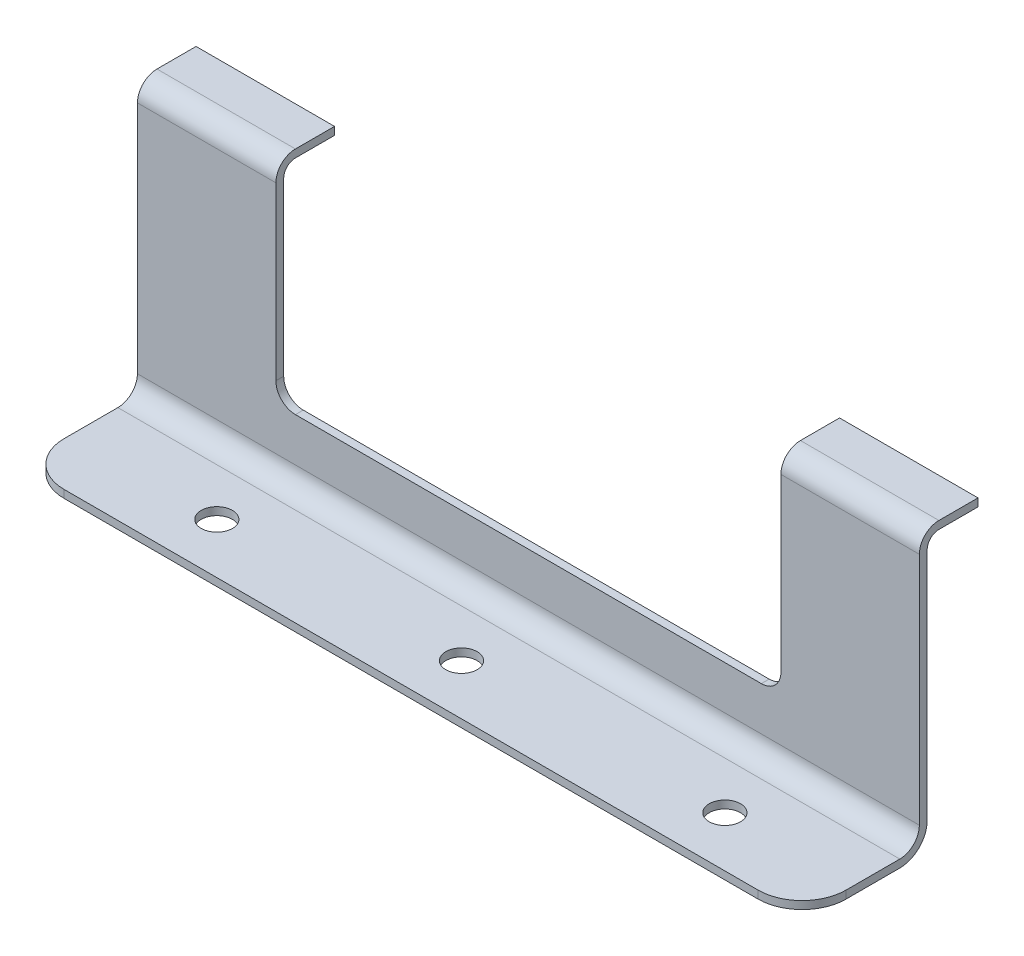
ISO-10303-21;
HEADER;
FILE_DESCRIPTION(('STEP AP214'),'2;1');
FILE_NAME('part.step','',(''),(''),'','','');
FILE_SCHEMA(('AUTOMOTIVE_DESIGN { 1 0 10303 214 1 1 1 1 }'));
ENDSEC;
DATA;
#1=APPLICATION_CONTEXT('core data for automotive mechanical design processes');
#2=APPLICATION_PROTOCOL_DEFINITION('international standard','automotive_design',2000,#1);
#3=PRODUCT_CONTEXT('',#1,'mechanical');
#4=PRODUCT('Part','Part','',(#3));
#5=PRODUCT_RELATED_PRODUCT_CATEGORY('part','',(#4));
#6=PRODUCT_DEFINITION_FORMATION('','',#4);
#7=PRODUCT_DEFINITION_CONTEXT('part definition',#1,'design');
#8=PRODUCT_DEFINITION('design','',#6,#7);
#9=PRODUCT_DEFINITION_SHAPE('','',#8);
#10=(LENGTH_UNIT() NAMED_UNIT(*) SI_UNIT(.MILLI.,.METRE.));
#11=(NAMED_UNIT(*) PLANE_ANGLE_UNIT() SI_UNIT($,.RADIAN.));
#12=(NAMED_UNIT(*) SI_UNIT($,.STERADIAN.) SOLID_ANGLE_UNIT());
#13=UNCERTAINTY_MEASURE_WITH_UNIT(LENGTH_MEASURE(1.E-05),#10,'distance_accuracy_value','');
#14=(GEOMETRIC_REPRESENTATION_CONTEXT(3) GLOBAL_UNCERTAINTY_ASSIGNED_CONTEXT((#13)) GLOBAL_UNIT_ASSIGNED_CONTEXT((#10,
#11,#12)) REPRESENTATION_CONTEXT('',''));
#15=CARTESIAN_POINT('',(0.,0.,0.));
#16=DIRECTION('',(0.,0.,1.));
#17=DIRECTION('',(1.,0.,0.));
#18=AXIS2_PLACEMENT_3D('',#15,#16,#17);
#19=CARTESIAN_POINT('',(200.,60.5454545454545,-8.80675383506639));
#20=DIRECTION('',(0.,0.,1.));
#21=DIRECTION('',(1.,0.,0.));
#22=AXIS2_PLACEMENT_3D('',#19,#20,#21);
#23=PLANE('',#22);
#24=DIRECTION('',(-1.,0.,0.));
#25=VECTOR('',#24,1.);
#26=CARTESIAN_POINT('',(200.,64.5454545454545,-8.80675383506639));
#27=LINE('',#26,#25);
#28=CARTESIAN_POINT('',(-129.169068804265,64.5454545454545,-8.80675383506639));
#29=VERTEX_POINT('',#28);
#30=CARTESIAN_POINT('',(-200.,64.5454545454545,-8.80675383506639));
#31=VERTEX_POINT('',#30);
#32=EDGE_CURVE('E447',#29,#31,#27,.T.);
#33=ORIENTED_EDGE('',*,*,#32,.F.);
#34=DIRECTION('',(0.,-1.,0.));
#35=VECTOR('',#34,1.);
#36=CARTESIAN_POINT('',(-129.169068804265,60.5454545454545,-8.80675383506639));
#37=LINE('',#36,#35);
#38=CARTESIAN_POINT('',(-129.169068804265,60.5454545454545,-8.80675383506639));
#39=VERTEX_POINT('',#38);
#40=EDGE_CURVE('E277',#29,#39,#37,.T.);
#41=ORIENTED_EDGE('',*,*,#40,.T.);
#42=DIRECTION('',(-1.,0.,0.));
#43=VECTOR('',#42,1.);
#44=CARTESIAN_POINT('',(200.,60.5454545454545,-8.80675383506639));
#45=LINE('',#44,#43);
#46=CARTESIAN_POINT('',(-200.,60.5454545454545,-8.80675383506639));
#47=VERTEX_POINT('',#46);
#48=EDGE_CURVE('E360',#39,#47,#45,.T.);
#49=ORIENTED_EDGE('',*,*,#48,.T.);
#50=DIRECTION('',(0.,1.,0.));
#51=VECTOR('',#50,1.);
#52=CARTESIAN_POINT('',(-200.,60.5454545454545,-8.80675383506639));
#53=LINE('',#52,#51);
#54=EDGE_CURVE('E323',#47,#31,#53,.T.);
#55=ORIENTED_EDGE('',*,*,#54,.T.);
#56=EDGE_LOOP('',(#33,#41,#49,#55));
#57=FACE_BOUND('',#56,.T.);
#58=ADVANCED_FACE('F43',(#57),#23,.F.);
#59=CARTESIAN_POINT('',(200.,64.5454545454545,-8.80675383506639));
#60=DIRECTION('',(0.,-1.,0.));
#61=DIRECTION('',(0.,0.,-1.));
#62=AXIS2_PLACEMENT_3D('',#59,#60,#61);
#63=PLANE('',#62);
#64=DIRECTION('',(-1.,0.,0.));
#65=VECTOR('',#64,1.);
#66=CARTESIAN_POINT('',(200.,64.5454545454545,11.1932461649336));
#67=LINE('',#66,#65);
#68=CARTESIAN_POINT('',(-129.169068804265,64.5454545454545,11.1932461649336));
#69=VERTEX_POINT('',#68);
#70=CARTESIAN_POINT('',(-200.,64.5454545454545,11.1932461649336));
#71=VERTEX_POINT('',#70);
#72=EDGE_CURVE('E442',#69,#71,#67,.T.);
#73=ORIENTED_EDGE('',*,*,#72,.F.);
#74=DIRECTION('',(0.,0.,-1.));
#75=VECTOR('',#74,1.);
#76=CARTESIAN_POINT('',(-129.169068804265,64.5454545454545,-8.80675383506639));
#77=LINE('',#76,#75);
#78=EDGE_CURVE('E281',#69,#29,#77,.T.);
#79=ORIENTED_EDGE('',*,*,#78,.T.);
#80=ORIENTED_EDGE('',*,*,#32,.T.);
#81=DIRECTION('',(0.,0.,1.));
#82=VECTOR('',#81,1.);
#83=CARTESIAN_POINT('',(-200.,64.5454545454545,-8.80675383506639));
#84=LINE('',#83,#82);
#85=EDGE_CURVE('E364',#31,#71,#84,.T.);
#86=ORIENTED_EDGE('',*,*,#85,.T.);
#87=EDGE_LOOP('',(#73,#79,#80,#86));
#88=FACE_BOUND('',#87,.T.);
#89=ADVANCED_FACE('F526',(#88),#63,.F.);
#90=CARTESIAN_POINT('',(200.,54.5454545454545,11.1932461649336));
#91=DIRECTION('',(-1.,0.,0.));
#92=DIRECTION('',(0.,0.,1.));
#93=AXIS2_PLACEMENT_3D('',#90,#91,#92);
#94=CYLINDRICAL_SURFACE('',#93,10.);
#95=DIRECTION('',(-1.,0.,0.));
#96=VECTOR('',#95,1.);
#97=CARTESIAN_POINT('',(200.,54.5454545454545,21.1932461649336));
#98=LINE('',#97,#96);
#99=CARTESIAN_POINT('',(-129.169068804265,54.5454545454545,21.1932461649336));
#100=VERTEX_POINT('',#99);
#101=CARTESIAN_POINT('',(-200.,54.5454545454545,21.1932461649336));
#102=VERTEX_POINT('',#101);
#103=EDGE_CURVE('E437',#100,#102,#98,.T.);
#104=ORIENTED_EDGE('',*,*,#103,.F.);
#105=CARTESIAN_POINT('',(-129.169068804265,54.5454545454545,11.1932461649336));
#106=DIRECTION('',(-1.,0.,0.));
#107=DIRECTION('',(0.,0.,1.));
#108=AXIS2_PLACEMENT_3D('',#105,#106,#107);
#109=CIRCLE('',#108,10.);
#110=EDGE_CURVE('E224',#100,#69,#109,.T.);
#111=ORIENTED_EDGE('',*,*,#110,.T.);
#112=ORIENTED_EDGE('',*,*,#72,.T.);
#113=CARTESIAN_POINT('',(-200.,54.5454545454545,11.1932461649336));
#114=DIRECTION('',(1.,0.,0.));
#115=DIRECTION('',(0.,0.,-1.));
#116=AXIS2_PLACEMENT_3D('',#113,#114,#115);
#117=CIRCLE('',#116,10.);
#118=EDGE_CURVE('E368',#71,#102,#117,.T.);
#119=ORIENTED_EDGE('',*,*,#118,.T.);
#120=EDGE_LOOP('',(#104,#111,#112,#119));
#121=FACE_BOUND('',#120,.T.);
#122=ADVANCED_FACE('F532',(#121),#94,.T.);
#123=CARTESIAN_POINT('',(200.,54.5454545454545,11.1932461649336));
#124=DIRECTION('',(-1.,0.,0.));
#125=DIRECTION('',(0.,0.,1.));
#126=AXIS2_PLACEMENT_3D('',#123,#124,#125);
#127=CYLINDRICAL_SURFACE('',#126,5.99999999999999);
#128=DIRECTION('',(-1.,0.,0.));
#129=VECTOR('',#128,1.);
#130=CARTESIAN_POINT('',(200.,60.5454545454545,11.1932461649336));
#131=LINE('',#130,#129);
#132=CARTESIAN_POINT('',(-129.169068804265,60.5454545454545,11.1932461649336));
#133=VERTEX_POINT('',#132);
#134=CARTESIAN_POINT('',(-200.,60.5454545454545,11.1932461649336));
#135=VERTEX_POINT('',#134);
#136=EDGE_CURVE('E403',#133,#135,#131,.T.);
#137=ORIENTED_EDGE('',*,*,#136,.F.);
#138=CARTESIAN_POINT('',(-129.169068804265,54.5454545454545,11.1932461649336));
#139=DIRECTION('',(-1.,0.,0.));
#140=DIRECTION('',(0.,0.,1.));
#141=AXIS2_PLACEMENT_3D('',#138,#139,#140);
#142=CIRCLE('',#141,5.99999999999999);
#143=CARTESIAN_POINT('',(-129.169068804265,54.5454545454545,17.1932461649336));
#144=VERTEX_POINT('',#143);
#145=EDGE_CURVE('E270',#133,#144,#142,.F.);
#146=ORIENTED_EDGE('',*,*,#145,.T.);
#147=DIRECTION('',(-1.,0.,0.));
#148=VECTOR('',#147,1.);
#149=CARTESIAN_POINT('',(200.,54.5454545454545,17.1932461649336));
#150=LINE('',#149,#148);
#151=CARTESIAN_POINT('',(-200.,54.5454545454545,17.1932461649336));
#152=VERTEX_POINT('',#151);
#153=EDGE_CURVE('E408',#144,#152,#150,.T.);
#154=ORIENTED_EDGE('',*,*,#153,.T.);
#155=CARTESIAN_POINT('',(-200.,54.5454545454545,11.1932461649336));
#156=DIRECTION('',(-1.,0.,0.));
#157=DIRECTION('',(0.,0.,-1.));
#158=AXIS2_PLACEMENT_3D('',#155,#156,#157);
#159=CIRCLE('',#158,5.99999999999999);
#160=EDGE_CURVE('E392',#152,#135,#159,.T.);
#161=ORIENTED_EDGE('',*,*,#160,.T.);
#162=EDGE_LOOP('',(#137,#146,#154,#161));
#163=FACE_BOUND('',#162,.T.);
#164=ADVANCED_FACE('F512',(#163),#127,.F.);
#165=CARTESIAN_POINT('',(200.,60.5454545454545,-8.80675383506639));
#166=DIRECTION('',(0.,1.,0.));
#167=DIRECTION('',(0.,0.,1.));
#168=AXIS2_PLACEMENT_3D('',#165,#166,#167);
#169=PLANE('',#168);
#170=ORIENTED_EDGE('',*,*,#48,.F.);
#171=DIRECTION('',(0.,0.,1.));
#172=VECTOR('',#171,1.);
#173=CARTESIAN_POINT('',(-129.169068804265,60.5454545454545,-8.80675383506639));
#174=LINE('',#173,#172);
#175=EDGE_CURVE('E470',#39,#133,#174,.T.);
#176=ORIENTED_EDGE('',*,*,#175,.T.);
#177=ORIENTED_EDGE('',*,*,#136,.T.);
#178=DIRECTION('',(0.,0.,-1.));
#179=VECTOR('',#178,1.);
#180=CARTESIAN_POINT('',(-200.,60.5454545454545,-8.80675383506639));
#181=LINE('',#180,#179);
#182=EDGE_CURVE('E329',#135,#47,#181,.T.);
#183=ORIENTED_EDGE('',*,*,#182,.T.);
#184=EDGE_LOOP('',(#170,#176,#177,#183));
#185=FACE_BOUND('',#184,.T.);
#186=ADVANCED_FACE('F520',(#185),#169,.F.);
#187=CARTESIAN_POINT('',(200.,-79.4545454545455,81.1932461649336));
#188=DIRECTION('',(0.,0.,-1.));
#189=DIRECTION('',(-1.,0.,0.));
#190=AXIS2_PLACEMENT_3D('',#187,#188,#189);
#191=PLANE('',#190);
#192=DIRECTION('',(-1.,0.,0.));
#193=VECTOR('',#192,1.);
#194=CARTESIAN_POINT('',(200.,-75.4545454545452,81.1932461649336));
#195=LINE('',#194,#193);
#196=CARTESIAN_POINT('',(177.506057891793,-75.4545454545452,81.1932461649334));
#197=VERTEX_POINT('',#196);
#198=CARTESIAN_POINT('',(-177.506057891793,-75.4545454545452,81.1932461649334));
#199=VERTEX_POINT('',#198);
#200=EDGE_CURVE('E425',#197,#199,#195,.T.);
#201=ORIENTED_EDGE('',*,*,#200,.T.);
#202=DIRECTION('',(0.,1.,0.));
#203=VECTOR('',#202,1.);
#204=CARTESIAN_POINT('',(-177.506057891793,-335.454545454546,81.1932461649319));
#205=LINE('',#204,#203);
#206=CARTESIAN_POINT('',(-177.506057891793,-79.4545454545455,81.1932461649334));
#207=VERTEX_POINT('',#206);
#208=EDGE_CURVE('E288',#207,#199,#205,.T.);
#209=ORIENTED_EDGE('',*,*,#208,.F.);
#210=DIRECTION('',(-1.,0.,0.));
#211=VECTOR('',#210,1.);
#212=CARTESIAN_POINT('',(200.,-79.4545454545455,81.1932461649336));
#213=LINE('',#212,#211);
#214=CARTESIAN_POINT('',(177.506057891793,-79.4545454545455,81.1932461649334));
#215=VERTEX_POINT('',#214);
#216=EDGE_CURVE('E421',#215,#207,#213,.T.);
#217=ORIENTED_EDGE('',*,*,#216,.F.);
#218=DIRECTION('',(0.,1.,0.));
#219=VECTOR('',#218,1.);
#220=CARTESIAN_POINT('',(177.506057891793,-335.454545454546,81.1932461649319));
#221=LINE('',#220,#219);
#222=EDGE_CURVE('E287',#215,#197,#221,.T.);
#223=ORIENTED_EDGE('',*,*,#222,.T.);
#224=EDGE_LOOP('',(#201,#209,#217,#223));
#225=FACE_BOUND('',#224,.T.);
#226=ADVANCED_FACE('F570',(#225),#191,.F.);
#227=CARTESIAN_POINT('',(200.,54.5454545454545,11.1932461649336));
#228=DIRECTION('',(1.,0.,0.));
#229=DIRECTION('',(0.,0.,-1.));
#230=AXIS2_PLACEMENT_3D('',#227,#228,#229);
#231=PLANE('',#230);
#232=DIRECTION('',(0.,0.,1.));
#233=VECTOR('',#232,1.);
#234=CARTESIAN_POINT('',(200.,-75.4545454545455,31.1932461649336));
#235=LINE('',#234,#233);
#236=CARTESIAN_POINT('',(200.,-75.4545454545455,31.1932461649336));
#237=VERTEX_POINT('',#236);
#238=CARTESIAN_POINT('',(200.,-75.4545454545454,58.6993040567263));
#239=VERTEX_POINT('',#238);
#240=EDGE_CURVE('E341',#237,#239,#235,.T.);
#241=ORIENTED_EDGE('',*,*,#240,.T.);
#242=DIRECTION('',(0.,1.,0.));
#243=VECTOR('',#242,1.);
#244=CARTESIAN_POINT('',(200.,-335.454545454546,58.6993040567248));
#245=LINE('',#244,#243);
#246=CARTESIAN_POINT('',(200.,-79.4545454545455,58.6993040567266));
#247=VERTEX_POINT('',#246);
#248=EDGE_CURVE('E455',#239,#247,#245,.F.);
#249=ORIENTED_EDGE('',*,*,#248,.T.);
#250=DIRECTION('',(0.,0.,-1.));
#251=VECTOR('',#250,1.);
#252=CARTESIAN_POINT('',(200.,-79.4545454545455,31.1932461649336));
#253=LINE('',#252,#251);
#254=CARTESIAN_POINT('',(200.,-79.4545454545455,31.1932461649336));
#255=VERTEX_POINT('',#254);
#256=EDGE_CURVE('E345',#247,#255,#253,.T.);
#257=ORIENTED_EDGE('',*,*,#256,.T.);
#258=CARTESIAN_POINT('',(200.,-65.4545454545455,31.1932461649336));
#259=DIRECTION('',(1.,0.,0.));
#260=DIRECTION('',(0.,0.,1.));
#261=AXIS2_PLACEMENT_3D('',#258,#259,#260);
#262=CIRCLE('',#261,14.);
#263=CARTESIAN_POINT('',(200.,-65.4545454545455,17.1932461649336));
#264=VERTEX_POINT('',#263);
#265=EDGE_CURVE('E348',#255,#264,#262,.T.);
#266=ORIENTED_EDGE('',*,*,#265,.T.);
#267=DIRECTION('',(0.,1.,0.));
#268=VECTOR('',#267,1.);
#269=CARTESIAN_POINT('',(200.,54.5454545454545,17.1932461649336));
#270=LINE('',#269,#268);
#271=CARTESIAN_POINT('',(200.,54.5454545454545,17.1932461649336));
#272=VERTEX_POINT('',#271);
#273=EDGE_CURVE('E351',#264,#272,#270,.T.);
#274=ORIENTED_EDGE('',*,*,#273,.T.);
#275=CARTESIAN_POINT('',(200.,54.5454545454545,11.1932461649336));
#276=DIRECTION('',(-1.,0.,0.));
#277=DIRECTION('',(0.,0.,-1.));
#278=AXIS2_PLACEMENT_3D('',#275,#276,#277);
#279=CIRCLE('',#278,5.99999999999999);
#280=CARTESIAN_POINT('',(200.,60.5454545454545,11.1932461649336));
#281=VERTEX_POINT('',#280);
#282=EDGE_CURVE('E354',#272,#281,#279,.T.);
#283=ORIENTED_EDGE('',*,*,#282,.T.);
#284=DIRECTION('',(0.,0.,-1.));
#285=VECTOR('',#284,1.);
#286=CARTESIAN_POINT('',(200.,60.5454545454545,-8.80675383506639));
#287=LINE('',#286,#285);
#288=CARTESIAN_POINT('',(200.,60.5454545454545,-8.80675383506639));
#289=VERTEX_POINT('',#288);
#290=EDGE_CURVE('E357',#281,#289,#287,.T.);
#291=ORIENTED_EDGE('',*,*,#290,.T.);
#292=DIRECTION('',(0.,1.,0.));
#293=VECTOR('',#292,1.);
#294=CARTESIAN_POINT('',(200.,60.5454545454545,-8.80675383506639));
#295=LINE('',#294,#293);
#296=CARTESIAN_POINT('',(200.,64.5454545454545,-8.80675383506639));
#297=VERTEX_POINT('',#296);
#298=EDGE_CURVE('E324',#289,#297,#295,.T.);
#299=ORIENTED_EDGE('',*,*,#298,.T.);
#300=DIRECTION('',(0.,0.,1.));
#301=VECTOR('',#300,1.);
#302=CARTESIAN_POINT('',(200.,64.5454545454545,-8.80675383506639));
#303=LINE('',#302,#301);
#304=CARTESIAN_POINT('',(200.,64.5454545454545,11.1932461649336));
#305=VERTEX_POINT('',#304);
#306=EDGE_CURVE('E328',#297,#305,#303,.T.);
#307=ORIENTED_EDGE('',*,*,#306,.T.);
#308=CARTESIAN_POINT('',(200.,54.5454545454545,11.1932461649336));
#309=DIRECTION('',(1.,0.,0.));
#310=DIRECTION('',(0.,0.,-1.));
#311=AXIS2_PLACEMENT_3D('',#308,#309,#310);
#312=CIRCLE('',#311,10.);
#313=CARTESIAN_POINT('',(200.,54.5454545454545,21.1932461649336));
#314=VERTEX_POINT('',#313);
#315=EDGE_CURVE('E332',#305,#314,#312,.T.);
#316=ORIENTED_EDGE('',*,*,#315,.T.);
#317=DIRECTION('',(0.,-1.,0.));
#318=VECTOR('',#317,1.);
#319=CARTESIAN_POINT('',(200.,54.5454545454545,21.1932461649336));
#320=LINE('',#319,#318);
#321=CARTESIAN_POINT('',(200.,-65.4545454545455,21.1932461649336));
#322=VERTEX_POINT('',#321);
#323=EDGE_CURVE('E335',#314,#322,#320,.T.);
#324=ORIENTED_EDGE('',*,*,#323,.T.);
#325=CARTESIAN_POINT('',(200.,-65.4545454545455,31.1932461649336));
#326=DIRECTION('',(-1.,0.,0.));
#327=DIRECTION('',(0.,0.,1.));
#328=AXIS2_PLACEMENT_3D('',#325,#326,#327);
#329=CIRCLE('',#328,10.);
#330=EDGE_CURVE('E338',#322,#237,#329,.T.);
#331=ORIENTED_EDGE('',*,*,#330,.T.);
#332=EDGE_LOOP('',(#241,#249,#257,#266,#274,#283,#291,#299,#307,#316,#324,#331));
#333=FACE_BOUND('',#332,.T.);
#334=ADVANCED_FACE('F496',(#333),#231,.T.);
#335=CARTESIAN_POINT('',(-200.,54.5454545454545,11.1932461649336));
#336=DIRECTION('',(1.,0.,0.));
#337=DIRECTION('',(0.,0.,-1.));
#338=AXIS2_PLACEMENT_3D('',#335,#336,#337);
#339=PLANE('',#338);
#340=DIRECTION('',(0.,1.,0.));
#341=VECTOR('',#340,1.);
#342=CARTESIAN_POINT('',(-200.,-335.454545454546,58.6993040567248));
#343=LINE('',#342,#341);
#344=CARTESIAN_POINT('',(-200.,-75.4545454545454,58.6993040567266));
#345=VERTEX_POINT('',#344);
#346=CARTESIAN_POINT('',(-200.,-79.4545454545455,58.6993040567262));
#347=VERTEX_POINT('',#346);
#348=EDGE_CURVE('E452',#345,#347,#343,.F.);
#349=ORIENTED_EDGE('',*,*,#348,.F.);
#350=DIRECTION('',(0.,0.,1.));
#351=VECTOR('',#350,1.);
#352=CARTESIAN_POINT('',(-200.,-75.4545454545455,31.1932461649336));
#353=LINE('',#352,#351);
#354=CARTESIAN_POINT('',(-200.,-75.4545454545455,31.1932461649336));
#355=VERTEX_POINT('',#354);
#356=EDGE_CURVE('E378',#355,#345,#353,.T.);
#357=ORIENTED_EDGE('',*,*,#356,.F.);
#358=CARTESIAN_POINT('',(-200.,-65.4545454545455,31.1932461649336));
#359=DIRECTION('',(-1.,0.,0.));
#360=DIRECTION('',(0.,0.,1.));
#361=AXIS2_PLACEMENT_3D('',#358,#359,#360);
#362=CIRCLE('',#361,10.);
#363=CARTESIAN_POINT('',(-200.,-65.4545454545455,21.1932461649336));
#364=VERTEX_POINT('',#363);
#365=EDGE_CURVE('E375',#364,#355,#362,.T.);
#366=ORIENTED_EDGE('',*,*,#365,.F.);
#367=DIRECTION('',(0.,-1.,0.));
#368=VECTOR('',#367,1.);
#369=CARTESIAN_POINT('',(-200.,54.5454545454545,21.1932461649336));
#370=LINE('',#369,#368);
#371=EDGE_CURVE('E372',#102,#364,#370,.T.);
#372=ORIENTED_EDGE('',*,*,#371,.F.);
#373=ORIENTED_EDGE('',*,*,#118,.F.);
#374=ORIENTED_EDGE('',*,*,#85,.F.);
#375=ORIENTED_EDGE('',*,*,#54,.F.);
#376=ORIENTED_EDGE('',*,*,#182,.F.);
#377=ORIENTED_EDGE('',*,*,#160,.F.);
#378=DIRECTION('',(0.,1.,0.));
#379=VECTOR('',#378,1.);
#380=CARTESIAN_POINT('',(-200.,54.5454545454545,17.1932461649336));
#381=LINE('',#380,#379);
#382=CARTESIAN_POINT('',(-200.,-65.4545454545455,17.1932461649336));
#383=VERTEX_POINT('',#382);
#384=EDGE_CURVE('E388',#383,#152,#381,.T.);
#385=ORIENTED_EDGE('',*,*,#384,.F.);
#386=CARTESIAN_POINT('',(-200.,-65.4545454545455,31.1932461649336));
#387=DIRECTION('',(1.,0.,0.));
#388=DIRECTION('',(0.,0.,1.));
#389=AXIS2_PLACEMENT_3D('',#386,#387,#388);
#390=CIRCLE('',#389,14.);
#391=CARTESIAN_POINT('',(-200.,-79.4545454545455,31.1932461649336));
#392=VERTEX_POINT('',#391);
#393=EDGE_CURVE('E385',#392,#383,#390,.T.);
#394=ORIENTED_EDGE('',*,*,#393,.F.);
#395=DIRECTION('',(0.,0.,-1.));
#396=VECTOR('',#395,1.);
#397=CARTESIAN_POINT('',(-200.,-79.4545454545455,31.1932461649336));
#398=LINE('',#397,#396);
#399=EDGE_CURVE('E382',#347,#392,#398,.T.);
#400=ORIENTED_EDGE('',*,*,#399,.F.);
#401=EDGE_LOOP('',(#349,#357,#366,#372,#373,#374,#375,#376,#377,#385,#394,#400));
#402=FACE_BOUND('',#401,.T.);
#403=ADVANCED_FACE('F506',(#402),#339,.F.);
#404=CARTESIAN_POINT('',(129.169068804265,60.5454545454545,-8.80675383506639));
#405=VERTEX_POINT('',#404);
#406=EDGE_CURVE('E399',#289,#405,#45,.T.);
#407=ORIENTED_EDGE('',*,*,#406,.T.);
#408=DIRECTION('',(0.,1.,0.));
#409=VECTOR('',#408,1.);
#410=CARTESIAN_POINT('',(129.169068804265,60.5454545454545,-8.80675383506639));
#411=LINE('',#410,#409);
#412=CARTESIAN_POINT('',(129.169068804265,64.5454545454545,-8.80675383506639));
#413=VERTEX_POINT('',#412);
#414=EDGE_CURVE('E59',#405,#413,#411,.T.);
#415=ORIENTED_EDGE('',*,*,#414,.T.);
#416=EDGE_CURVE('E448',#297,#413,#27,.T.);
#417=ORIENTED_EDGE('',*,*,#416,.F.);
#418=ORIENTED_EDGE('',*,*,#298,.F.);
#419=EDGE_LOOP('',(#407,#415,#417,#418));
#420=FACE_BOUND('',#419,.T.);
#421=ADVANCED_FACE('F45',(#420),#23,.F.);
#422=ORIENTED_EDGE('',*,*,#416,.T.);
#423=DIRECTION('',(0.,0.,1.));
#424=VECTOR('',#423,1.);
#425=CARTESIAN_POINT('',(129.169068804265,64.5454545454545,-8.80675383506639));
#426=LINE('',#425,#424);
#427=CARTESIAN_POINT('',(129.169068804265,64.5454545454545,11.1932461649336));
#428=VERTEX_POINT('',#427);
#429=EDGE_CURVE('E262',#413,#428,#426,.T.);
#430=ORIENTED_EDGE('',*,*,#429,.T.);
#431=EDGE_CURVE('E443',#305,#428,#67,.T.);
#432=ORIENTED_EDGE('',*,*,#431,.F.);
#433=ORIENTED_EDGE('',*,*,#306,.F.);
#434=EDGE_LOOP('',(#422,#430,#432,#433));
#435=FACE_BOUND('',#434,.T.);
#436=ADVANCED_FACE('F551',(#435),#63,.F.);
#437=ORIENTED_EDGE('',*,*,#431,.T.);
#438=CARTESIAN_POINT('',(129.169068804265,54.5454545454545,11.1932461649336));
#439=DIRECTION('',(1.,0.,0.));
#440=DIRECTION('',(0.,0.,-1.));
#441=AXIS2_PLACEMENT_3D('',#438,#439,#440);
#442=CIRCLE('',#441,10.);
#443=CARTESIAN_POINT('',(129.169068804265,54.5454545454545,21.1932461649336));
#444=VERTEX_POINT('',#443);
#445=EDGE_CURVE('E266',#428,#444,#442,.T.);
#446=ORIENTED_EDGE('',*,*,#445,.T.);
#447=EDGE_CURVE('E438',#314,#444,#98,.T.);
#448=ORIENTED_EDGE('',*,*,#447,.F.);
#449=ORIENTED_EDGE('',*,*,#315,.F.);
#450=EDGE_LOOP('',(#437,#446,#448,#449));
#451=FACE_BOUND('',#450,.T.);
#452=ADVANCED_FACE('F548',(#451),#94,.T.);
#453=CARTESIAN_POINT('',(200.,54.5454545454545,21.1932461649336));
#454=DIRECTION('',(0.,0.,-1.));
#455=DIRECTION('',(0.,1.,0.));
#456=AXIS2_PLACEMENT_3D('',#453,#454,#455);
#457=PLANE('',#456);
#458=CARTESIAN_POINT('',(-119.169068804265,-33.1462433035718,21.1932461649336));
#459=DIRECTION('',(0.,0.,1.));
#460=DIRECTION('',(1.,0.,0.));
#461=AXIS2_PLACEMENT_3D('',#458,#459,#460);
#462=CIRCLE('',#461,10.);
#463=CARTESIAN_POINT('',(-129.169068804265,-33.1462433035717,21.1932461649336));
#464=VERTEX_POINT('',#463);
#465=CARTESIAN_POINT('',(-119.169068804265,-43.1462433035718,21.1932461649336));
#466=VERTEX_POINT('',#465);
#467=EDGE_CURVE('E210',#464,#466,#462,.T.);
#468=ORIENTED_EDGE('',*,*,#467,.F.);
#469=DIRECTION('',(0.,-1.,0.));
#470=VECTOR('',#469,1.);
#471=CARTESIAN_POINT('',(-129.169068804265,356.908815507352,21.1932461649336));
#472=LINE('',#471,#470);
#473=EDGE_CURVE('E221',#100,#464,#472,.T.);
#474=ORIENTED_EDGE('',*,*,#473,.F.);
#475=ORIENTED_EDGE('',*,*,#103,.T.);
#476=ORIENTED_EDGE('',*,*,#371,.T.);
#477=DIRECTION('',(-1.,0.,0.));
#478=VECTOR('',#477,1.);
#479=CARTESIAN_POINT('',(200.,-65.4545454545455,21.1932461649336));
#480=LINE('',#479,#478);
#481=EDGE_CURVE('E433',#322,#364,#480,.T.);
#482=ORIENTED_EDGE('',*,*,#481,.F.);
#483=ORIENTED_EDGE('',*,*,#323,.F.);
#484=ORIENTED_EDGE('',*,*,#447,.T.);
#485=DIRECTION('',(0.,1.,0.));
#486=VECTOR('',#485,1.);
#487=CARTESIAN_POINT('',(129.169068804265,356.908815507352,21.1932461649336));
#488=LINE('',#487,#486);
#489=CARTESIAN_POINT('',(129.169068804265,-33.1462433035717,21.1932461649336));
#490=VERTEX_POINT('',#489);
#491=EDGE_CURVE('E218',#490,#444,#488,.T.);
#492=ORIENTED_EDGE('',*,*,#491,.F.);
#493=CARTESIAN_POINT('',(119.169068804265,-33.1462433035718,21.1932461649336));
#494=DIRECTION('',(0.,0.,1.));
#495=DIRECTION('',(1.,0.,0.));
#496=AXIS2_PLACEMENT_3D('',#493,#494,#495);
#497=CIRCLE('',#496,10.);
#498=CARTESIAN_POINT('',(119.169068804265,-43.1462433035718,21.1932461649336));
#499=VERTEX_POINT('',#498);
#500=EDGE_CURVE('E236',#499,#490,#497,.T.);
#501=ORIENTED_EDGE('',*,*,#500,.F.);
#502=DIRECTION('',(1.,0.,0.));
#503=VECTOR('',#502,1.);
#504=CARTESIAN_POINT('',(-119.169068804265,-43.1462433035718,21.1932461649336));
#505=LINE('',#504,#503);
#506=EDGE_CURVE('E232',#466,#499,#505,.T.);
#507=ORIENTED_EDGE('',*,*,#506,.F.);
#508=EDGE_LOOP('',(#468,#474,#475,#476,#482,#483,#484,#492,#501,#507));
#509=FACE_BOUND('',#508,.T.);
#510=ADVANCED_FACE('F229',(#509),#457,.F.);
#511=CARTESIAN_POINT('',(200.,-65.4545454545455,31.1932461649336));
#512=DIRECTION('',(-1.,0.,0.));
#513=DIRECTION('',(0.,0.,1.));
#514=AXIS2_PLACEMENT_3D('',#511,#512,#513);
#515=CYLINDRICAL_SURFACE('',#514,10.);
#516=ORIENTED_EDGE('',*,*,#365,.T.);
#517=DIRECTION('',(-1.,0.,0.));
#518=VECTOR('',#517,1.);
#519=CARTESIAN_POINT('',(200.,-75.4545454545455,31.1932461649336));
#520=LINE('',#519,#518);
#521=EDGE_CURVE('E429',#237,#355,#520,.T.);
#522=ORIENTED_EDGE('',*,*,#521,.F.);
#523=ORIENTED_EDGE('',*,*,#330,.F.);
#524=ORIENTED_EDGE('',*,*,#481,.T.);
#525=EDGE_LOOP('',(#516,#522,#523,#524));
#526=FACE_BOUND('',#525,.T.);
#527=ADVANCED_FACE('F537',(#526),#515,.F.);
#528=CARTESIAN_POINT('',(200.,-75.4545454545455,31.1932461649336));
#529=DIRECTION('',(0.,-1.,0.));
#530=DIRECTION('',(0.,0.,-1.));
#531=AXIS2_PLACEMENT_3D('',#528,#529,#530);
#532=PLANE('',#531);
#533=CARTESIAN_POINT('',(134.743980288752,-75.4545454545454,55.414833784615));
#534=DIRECTION('',(0.,-1.,0.));
#535=DIRECTION('',(0.,0.,-1.));
#536=AXIS2_PLACEMENT_3D('',#533,#534,#535);
#537=CIRCLE('',#536,8.00000000000001);
#538=CARTESIAN_POINT('',(134.743980288752,-75.4545454545454,47.414833784615));
#539=VERTEX_POINT('',#538);
#540=EDGE_CURVE('E319',#539,#539,#537,.T.);
#541=ORIENTED_EDGE('',*,*,#540,.T.);
#542=EDGE_LOOP('',(#541));
#543=FACE_BOUND('',#542,.T.);
#544=CARTESIAN_POINT('',(-125.153892723709,-75.4545454545454,55.414833784615));
#545=DIRECTION('',(0.,-1.,0.));
#546=DIRECTION('',(0.,0.,-1.));
#547=AXIS2_PLACEMENT_3D('',#544,#545,#546);
#548=CIRCLE('',#547,8.00000000000001);
#549=CARTESIAN_POINT('',(-125.153892723709,-75.4545454545454,47.414833784615));
#550=VERTEX_POINT('',#549);
#551=EDGE_CURVE('E314',#550,#550,#548,.T.);
#552=ORIENTED_EDGE('',*,*,#551,.T.);
#553=EDGE_LOOP('',(#552));
#554=FACE_BOUND('',#553,.T.);
#555=CARTESIAN_POINT('',(0.,-75.4545454545454,55.414833784615));
#556=DIRECTION('',(0.,-1.,0.));
#557=DIRECTION('',(0.,0.,-1.));
#558=AXIS2_PLACEMENT_3D('',#555,#556,#557);
#559=CIRCLE('',#558,8.);
#560=CARTESIAN_POINT('',(0.,-75.4545454545454,47.414833784615));
#561=VERTEX_POINT('',#560);
#562=EDGE_CURVE('E309',#561,#561,#559,.T.);
#563=ORIENTED_EDGE('',*,*,#562,.T.);
#564=EDGE_LOOP('',(#563));
#565=FACE_BOUND('',#564,.T.);
#566=ORIENTED_EDGE('',*,*,#356,.T.);
#567=CARTESIAN_POINT('',(-177.506057891793,-75.4545454545454,58.6993040567263));
#568=DIRECTION('',(0.,-1.,0.));
#569=DIRECTION('',(0.,0.,-1.));
#570=AXIS2_PLACEMENT_3D('',#567,#568,#569);
#571=CIRCLE('',#570,22.4939421082071);
#572=EDGE_CURVE('E298',#345,#199,#571,.F.);
#573=ORIENTED_EDGE('',*,*,#572,.T.);
#574=ORIENTED_EDGE('',*,*,#200,.F.);
#575=CARTESIAN_POINT('',(177.506057891793,-75.4545454545454,58.6993040567263));
#576=DIRECTION('',(0.,-1.,0.));
#577=DIRECTION('',(0.,0.,-1.));
#578=AXIS2_PLACEMENT_3D('',#575,#576,#577);
#579=CIRCLE('',#578,22.4939421082071);
#580=EDGE_CURVE('E304',#197,#239,#579,.F.);
#581=ORIENTED_EDGE('',*,*,#580,.T.);
#582=ORIENTED_EDGE('',*,*,#240,.F.);
#583=ORIENTED_EDGE('',*,*,#521,.T.);
#584=EDGE_LOOP('',(#566,#573,#574,#581,#582,#583));
#585=FACE_BOUND('',#584,.T.);
#586=ADVANCED_FACE('F541',(#543,#554,#565,#585),#532,.F.);
#587=CARTESIAN_POINT('',(200.,-79.4545454545455,31.1932461649336));
#588=DIRECTION('',(0.,1.,0.));
#589=DIRECTION('',(0.,0.,1.));
#590=AXIS2_PLACEMENT_3D('',#587,#588,#589);
#591=PLANE('',#590);
#592=CARTESIAN_POINT('',(134.743980288752,-79.4545454545455,55.414833784615));
#593=DIRECTION('',(0.,1.,0.));
#594=DIRECTION('',(0.,0.,1.));
#595=AXIS2_PLACEMENT_3D('',#592,#593,#594);
#596=CIRCLE('',#595,8.00000000000001);
#597=CARTESIAN_POINT('',(134.743980288752,-79.4545454545455,63.414833784615));
#598=VERTEX_POINT('',#597);
#599=EDGE_CURVE('E318',#598,#598,#596,.T.);
#600=ORIENTED_EDGE('',*,*,#599,.T.);
#601=EDGE_LOOP('',(#600));
#602=FACE_BOUND('',#601,.T.);
#603=CARTESIAN_POINT('',(-125.153892723709,-79.4545454545455,55.414833784615));
#604=DIRECTION('',(0.,1.,0.));
#605=DIRECTION('',(0.,0.,1.));
#606=AXIS2_PLACEMENT_3D('',#603,#604,#605);
#607=CIRCLE('',#606,8.00000000000001);
#608=CARTESIAN_POINT('',(-125.153892723709,-79.4545454545455,63.414833784615));
#609=VERTEX_POINT('',#608);
#610=EDGE_CURVE('E313',#609,#609,#607,.T.);
#611=ORIENTED_EDGE('',*,*,#610,.T.);
#612=EDGE_LOOP('',(#611));
#613=FACE_BOUND('',#612,.T.);
#614=CARTESIAN_POINT('',(0.,-79.4545454545455,55.414833784615));
#615=DIRECTION('',(0.,1.,0.));
#616=DIRECTION('',(0.,0.,1.));
#617=AXIS2_PLACEMENT_3D('',#614,#615,#616);
#618=CIRCLE('',#617,8.);
#619=CARTESIAN_POINT('',(0.,-79.4545454545455,63.414833784615));
#620=VERTEX_POINT('',#619);
#621=EDGE_CURVE('E308',#620,#620,#618,.T.);
#622=ORIENTED_EDGE('',*,*,#621,.T.);
#623=EDGE_LOOP('',(#622));
#624=FACE_BOUND('',#623,.T.);
#625=ORIENTED_EDGE('',*,*,#216,.T.);
#626=CARTESIAN_POINT('',(-177.506057891793,-79.4545454545455,58.6993040567262));
#627=DIRECTION('',(0.,1.,0.));
#628=DIRECTION('',(0.,0.,1.));
#629=AXIS2_PLACEMENT_3D('',#626,#627,#628);
#630=CIRCLE('',#629,22.4939421082071);
#631=EDGE_CURVE('E291',#207,#347,#630,.F.);
#632=ORIENTED_EDGE('',*,*,#631,.T.);
#633=ORIENTED_EDGE('',*,*,#399,.T.);
#634=DIRECTION('',(-1.,0.,0.));
#635=VECTOR('',#634,1.);
#636=CARTESIAN_POINT('',(200.,-79.4545454545455,31.1932461649336));
#637=LINE('',#636,#635);
#638=EDGE_CURVE('E417',#255,#392,#637,.T.);
#639=ORIENTED_EDGE('',*,*,#638,.F.);
#640=ORIENTED_EDGE('',*,*,#256,.F.);
#641=CARTESIAN_POINT('',(177.506057891793,-79.4545454545455,58.6993040567262));
#642=DIRECTION('',(0.,1.,0.));
#643=DIRECTION('',(0.,0.,1.));
#644=AXIS2_PLACEMENT_3D('',#641,#642,#643);
#645=CIRCLE('',#644,22.4939421082071);
#646=EDGE_CURVE('E67',#247,#215,#645,.F.);
#647=ORIENTED_EDGE('',*,*,#646,.T.);
#648=EDGE_LOOP('',(#625,#632,#633,#639,#640,#647));
#649=FACE_BOUND('',#648,.T.);
#650=ADVANCED_FACE('F676',(#602,#613,#624,#649),#591,.F.);
#651=CARTESIAN_POINT('',(200.,-65.4545454545455,31.1932461649336));
#652=DIRECTION('',(-1.,0.,0.));
#653=DIRECTION('',(0.,0.,1.));
#654=AXIS2_PLACEMENT_3D('',#651,#652,#653);
#655=CYLINDRICAL_SURFACE('',#654,14.);
#656=ORIENTED_EDGE('',*,*,#393,.T.);
#657=DIRECTION('',(-1.,0.,0.));
#658=VECTOR('',#657,1.);
#659=CARTESIAN_POINT('',(200.,-65.4545454545455,17.1932461649336));
#660=LINE('',#659,#658);
#661=EDGE_CURVE('E413',#264,#383,#660,.T.);
#662=ORIENTED_EDGE('',*,*,#661,.F.);
#663=ORIENTED_EDGE('',*,*,#265,.F.);
#664=ORIENTED_EDGE('',*,*,#638,.T.);
#665=EDGE_LOOP('',(#656,#662,#663,#664));
#666=FACE_BOUND('',#665,.T.);
#667=ADVANCED_FACE('F666',(#666),#655,.T.);
#668=CARTESIAN_POINT('',(200.,54.5454545454545,17.1932461649336));
#669=DIRECTION('',(0.,0.,1.));
#670=DIRECTION('',(0.,-1.,0.));
#671=AXIS2_PLACEMENT_3D('',#668,#669,#670);
#672=PLANE('',#671);
#673=ORIENTED_EDGE('',*,*,#153,.F.);
#674=DIRECTION('',(0.,-1.,0.));
#675=VECTOR('',#674,1.);
#676=CARTESIAN_POINT('',(-129.169068804265,54.5454545454545,17.1932461649336));
#677=LINE('',#676,#675);
#678=CARTESIAN_POINT('',(-129.169068804265,-33.1462433035717,17.1932461649336));
#679=VERTEX_POINT('',#678);
#680=EDGE_CURVE('E274',#144,#679,#677,.T.);
#681=ORIENTED_EDGE('',*,*,#680,.T.);
#682=CARTESIAN_POINT('',(-119.169068804265,-33.1462433035718,17.1932461649336));
#683=DIRECTION('',(0.,0.,1.));
#684=DIRECTION('',(0.,-1.,0.));
#685=AXIS2_PLACEMENT_3D('',#682,#683,#684);
#686=CIRCLE('',#685,10.);
#687=CARTESIAN_POINT('',(-119.169068804265,-43.1462433035718,17.1932461649336));
#688=VERTEX_POINT('',#687);
#689=EDGE_CURVE('E213',#679,#688,#686,.T.);
#690=ORIENTED_EDGE('',*,*,#689,.T.);
#691=DIRECTION('',(1.,0.,0.));
#692=VECTOR('',#691,1.);
#693=CARTESIAN_POINT('',(200.,-43.1462433035718,17.1932461649336));
#694=LINE('',#693,#692);
#695=CARTESIAN_POINT('',(119.169068804265,-43.1462433035718,17.1932461649336));
#696=VERTEX_POINT('',#695);
#697=EDGE_CURVE('E52',#688,#696,#694,.T.);
#698=ORIENTED_EDGE('',*,*,#697,.T.);
#699=CARTESIAN_POINT('',(119.169068804265,-33.1462433035718,17.1932461649336));
#700=DIRECTION('',(0.,0.,1.));
#701=DIRECTION('',(0.,-1.,0.));
#702=AXIS2_PLACEMENT_3D('',#699,#700,#701);
#703=CIRCLE('',#702,10.);
#704=CARTESIAN_POINT('',(129.169068804265,-33.1462433035717,17.1932461649336));
#705=VERTEX_POINT('',#704);
#706=EDGE_CURVE('E11',#696,#705,#703,.T.);
#707=ORIENTED_EDGE('',*,*,#706,.T.);
#708=DIRECTION('',(0.,1.,0.));
#709=VECTOR('',#708,1.);
#710=CARTESIAN_POINT('',(129.169068804265,54.5454545454545,17.1932461649336));
#711=LINE('',#710,#709);
#712=CARTESIAN_POINT('',(129.169068804265,54.5454545454545,17.1932461649336));
#713=VERTEX_POINT('',#712);
#714=EDGE_CURVE('E256',#705,#713,#711,.T.);
#715=ORIENTED_EDGE('',*,*,#714,.T.);
#716=EDGE_CURVE('E409',#272,#713,#150,.T.);
#717=ORIENTED_EDGE('',*,*,#716,.F.);
#718=ORIENTED_EDGE('',*,*,#273,.F.);
#719=ORIENTED_EDGE('',*,*,#661,.T.);
#720=ORIENTED_EDGE('',*,*,#384,.T.);
#721=EDGE_LOOP('',(#673,#681,#690,#698,#707,#715,#717,#718,#719,#720));
#722=FACE_BOUND('',#721,.T.);
#723=ADVANCED_FACE('F479',(#722),#672,.F.);
#724=ORIENTED_EDGE('',*,*,#716,.T.);
#725=CARTESIAN_POINT('',(129.169068804265,54.5454545454545,11.1932461649336));
#726=DIRECTION('',(1.,0.,0.));
#727=DIRECTION('',(0.,0.,-1.));
#728=AXIS2_PLACEMENT_3D('',#725,#726,#727);
#729=CIRCLE('',#728,5.99999999999999);
#730=CARTESIAN_POINT('',(129.169068804265,60.5454545454545,11.1932461649336));
#731=VERTEX_POINT('',#730);
#732=EDGE_CURVE('E247',#713,#731,#729,.F.);
#733=ORIENTED_EDGE('',*,*,#732,.T.);
#734=EDGE_CURVE('E404',#281,#731,#131,.T.);
#735=ORIENTED_EDGE('',*,*,#734,.F.);
#736=ORIENTED_EDGE('',*,*,#282,.F.);
#737=EDGE_LOOP('',(#724,#733,#735,#736));
#738=FACE_BOUND('',#737,.T.);
#739=ADVANCED_FACE('F492',(#738),#127,.F.);
#740=ORIENTED_EDGE('',*,*,#734,.T.);
#741=DIRECTION('',(0.,0.,-1.));
#742=VECTOR('',#741,1.);
#743=CARTESIAN_POINT('',(129.169068804265,60.5454545454545,-8.80675383506639));
#744=LINE('',#743,#742);
#745=EDGE_CURVE('E458',#731,#405,#744,.T.);
#746=ORIENTED_EDGE('',*,*,#745,.T.);
#747=ORIENTED_EDGE('',*,*,#406,.F.);
#748=ORIENTED_EDGE('',*,*,#290,.F.);
#749=EDGE_LOOP('',(#740,#746,#747,#748));
#750=FACE_BOUND('',#749,.T.);
#751=ADVANCED_FACE('F556',(#750),#169,.F.);
#752=CARTESIAN_POINT('',(-177.506057891793,-335.454545454546,58.6993040567248));
#753=DIRECTION('',(0.,1.,0.));
#754=DIRECTION('',(0.,0.,1.));
#755=AXIS2_PLACEMENT_3D('',#752,#753,#754);
#756=CYLINDRICAL_SURFACE('',#755,22.4939421082071);
#757=ORIENTED_EDGE('',*,*,#348,.T.);
#758=ORIENTED_EDGE('',*,*,#631,.F.);
#759=ORIENTED_EDGE('',*,*,#208,.T.);
#760=ORIENTED_EDGE('',*,*,#572,.F.);
#761=EDGE_LOOP('',(#757,#758,#759,#760));
#762=FACE_BOUND('',#761,.T.);
#763=ADVANCED_FACE('F558',(#762),#756,.T.);
#764=CARTESIAN_POINT('',(177.506057891793,-335.454545454546,58.6993040567248));
#765=DIRECTION('',(0.,1.,0.));
#766=DIRECTION('',(0.,0.,1.));
#767=AXIS2_PLACEMENT_3D('',#764,#765,#766);
#768=CYLINDRICAL_SURFACE('',#767,22.4939421082071);
#769=ORIENTED_EDGE('',*,*,#222,.F.);
#770=ORIENTED_EDGE('',*,*,#646,.F.);
#771=ORIENTED_EDGE('',*,*,#248,.F.);
#772=ORIENTED_EDGE('',*,*,#580,.F.);
#773=EDGE_LOOP('',(#769,#770,#771,#772));
#774=FACE_BOUND('',#773,.T.);
#775=ADVANCED_FACE('F564',(#774),#768,.T.);
#776=CARTESIAN_POINT('',(0.,-335.454545454546,55.4148337846136));
#777=DIRECTION('',(0.,1.,0.));
#778=DIRECTION('',(0.,0.,1.));
#779=AXIS2_PLACEMENT_3D('',#776,#777,#778);
#780=CYLINDRICAL_SURFACE('',#779,8.);
#781=ORIENTED_EDGE('',*,*,#621,.F.);
#782=EDGE_LOOP('',(#781));
#783=FACE_BOUND('',#782,.T.);
#784=ORIENTED_EDGE('',*,*,#562,.F.);
#785=EDGE_LOOP('',(#784));
#786=FACE_BOUND('',#785,.T.);
#787=ADVANCED_FACE('F585',(#783,#786),#780,.F.);
#788=CARTESIAN_POINT('',(-125.153892723709,-335.454545454546,55.4148337846136));
#789=DIRECTION('',(0.,1.,0.));
#790=DIRECTION('',(0.,0.,1.));
#791=AXIS2_PLACEMENT_3D('',#788,#789,#790);
#792=CYLINDRICAL_SURFACE('',#791,8.00000000000001);
#793=ORIENTED_EDGE('',*,*,#610,.F.);
#794=EDGE_LOOP('',(#793));
#795=FACE_BOUND('',#794,.T.);
#796=ORIENTED_EDGE('',*,*,#551,.F.);
#797=EDGE_LOOP('',(#796));
#798=FACE_BOUND('',#797,.T.);
#799=ADVANCED_FACE('F588',(#795,#798),#792,.F.);
#800=CARTESIAN_POINT('',(134.743980288752,-335.454545454546,55.4148337846136));
#801=DIRECTION('',(0.,1.,0.));
#802=DIRECTION('',(0.,0.,1.));
#803=AXIS2_PLACEMENT_3D('',#800,#801,#802);
#804=CYLINDRICAL_SURFACE('',#803,8.00000000000001);
#805=ORIENTED_EDGE('',*,*,#599,.F.);
#806=EDGE_LOOP('',(#805));
#807=FACE_BOUND('',#806,.T.);
#808=ORIENTED_EDGE('',*,*,#540,.F.);
#809=EDGE_LOOP('',(#808));
#810=FACE_BOUND('',#809,.T.);
#811=ADVANCED_FACE('F592',(#807,#810),#804,.F.);
#812=CARTESIAN_POINT('',(119.169068804265,-33.1462433035718,-378.806753835066));
#813=DIRECTION('',(0.,0.,1.));
#814=DIRECTION('',(1.,0.,0.));
#815=AXIS2_PLACEMENT_3D('',#812,#813,#814);
#816=CYLINDRICAL_SURFACE('',#815,10.);
#817=DIRECTION('',(0.,0.,1.));
#818=VECTOR('',#817,1.);
#819=CARTESIAN_POINT('',(119.169068804265,-43.1462433035718,-378.806753835066));
#820=LINE('',#819,#818);
#821=EDGE_CURVE('E248',#696,#499,#820,.T.);
#822=ORIENTED_EDGE('',*,*,#821,.T.);
#823=ORIENTED_EDGE('',*,*,#500,.T.);
#824=DIRECTION('',(0.,0.,1.));
#825=VECTOR('',#824,1.);
#826=CARTESIAN_POINT('',(129.169068804265,-33.1462433035717,-378.806753835066));
#827=LINE('',#826,#825);
#828=EDGE_CURVE('E244',#705,#490,#827,.T.);
#829=ORIENTED_EDGE('',*,*,#828,.F.);
#830=ORIENTED_EDGE('',*,*,#706,.F.);
#831=EDGE_LOOP('',(#822,#823,#829,#830));
#832=FACE_BOUND('',#831,.T.);
#833=ADVANCED_FACE('F484',(#832),#816,.F.);
#834=CARTESIAN_POINT('',(-119.169068804265,-43.1462433035718,-378.806753835066));
#835=DIRECTION('',(0.,-1.,0.));
#836=DIRECTION('',(0.,0.,-1.));
#837=AXIS2_PLACEMENT_3D('',#834,#835,#836);
#838=PLANE('',#837);
#839=DIRECTION('',(0.,0.,1.));
#840=VECTOR('',#839,1.);
#841=CARTESIAN_POINT('',(-119.169068804265,-43.1462433035718,-378.806753835066));
#842=LINE('',#841,#840);
#843=EDGE_CURVE('E217',#688,#466,#842,.T.);
#844=ORIENTED_EDGE('',*,*,#843,.T.);
#845=ORIENTED_EDGE('',*,*,#506,.T.);
#846=ORIENTED_EDGE('',*,*,#821,.F.);
#847=ORIENTED_EDGE('',*,*,#697,.F.);
#848=EDGE_LOOP('',(#844,#845,#846,#847));
#849=FACE_BOUND('',#848,.T.);
#850=ADVANCED_FACE('F482',(#849),#838,.F.);
#851=CARTESIAN_POINT('',(-119.169068804265,-33.1462433035718,-378.806753835066));
#852=DIRECTION('',(0.,0.,1.));
#853=DIRECTION('',(1.,0.,0.));
#854=AXIS2_PLACEMENT_3D('',#851,#852,#853);
#855=CYLINDRICAL_SURFACE('',#854,10.);
#856=DIRECTION('',(0.,0.,1.));
#857=VECTOR('',#856,1.);
#858=CARTESIAN_POINT('',(-129.169068804265,-33.1462433035717,-378.806753835066));
#859=LINE('',#858,#857);
#860=EDGE_CURVE('E205',#679,#464,#859,.T.);
#861=ORIENTED_EDGE('',*,*,#860,.T.);
#862=ORIENTED_EDGE('',*,*,#467,.T.);
#863=ORIENTED_EDGE('',*,*,#843,.F.);
#864=ORIENTED_EDGE('',*,*,#689,.F.);
#865=EDGE_LOOP('',(#861,#862,#863,#864));
#866=FACE_BOUND('',#865,.T.);
#867=ADVANCED_FACE('F207',(#866),#855,.F.);
#868=CARTESIAN_POINT('',(-129.169068804265,356.908815507352,-378.806753835066));
#869=DIRECTION('',(-1.,0.,0.));
#870=DIRECTION('',(0.,0.,1.));
#871=AXIS2_PLACEMENT_3D('',#868,#869,#870);
#872=PLANE('',#871);
#873=ORIENTED_EDGE('',*,*,#473,.T.);
#874=ORIENTED_EDGE('',*,*,#860,.F.);
#875=ORIENTED_EDGE('',*,*,#680,.F.);
#876=ORIENTED_EDGE('',*,*,#145,.F.);
#877=ORIENTED_EDGE('',*,*,#175,.F.);
#878=ORIENTED_EDGE('',*,*,#40,.F.);
#879=ORIENTED_EDGE('',*,*,#78,.F.);
#880=ORIENTED_EDGE('',*,*,#110,.F.);
#881=EDGE_LOOP('',(#873,#874,#875,#876,#877,#878,#879,#880));
#882=FACE_BOUND('',#881,.T.);
#883=ADVANCED_FACE('F222',(#882),#872,.F.);
#884=CARTESIAN_POINT('',(129.169068804265,356.908815507352,-378.806753835066));
#885=DIRECTION('',(1.,0.,0.));
#886=DIRECTION('',(0.,0.,-1.));
#887=AXIS2_PLACEMENT_3D('',#884,#885,#886);
#888=PLANE('',#887);
#889=ORIENTED_EDGE('',*,*,#429,.F.);
#890=ORIENTED_EDGE('',*,*,#414,.F.);
#891=ORIENTED_EDGE('',*,*,#745,.F.);
#892=ORIENTED_EDGE('',*,*,#732,.F.);
#893=ORIENTED_EDGE('',*,*,#714,.F.);
#894=ORIENTED_EDGE('',*,*,#828,.T.);
#895=ORIENTED_EDGE('',*,*,#491,.T.);
#896=ORIENTED_EDGE('',*,*,#445,.F.);
#897=EDGE_LOOP('',(#889,#890,#891,#892,#893,#894,#895,#896));
#898=FACE_BOUND('',#897,.T.);
#899=ADVANCED_FACE('F487',(#898),#888,.F.);
#900=CLOSED_SHELL('',(#58,#89,#122,#164,#186,#226,#334,#403,#421,#436,#452,#510,#527,#586,#650,
#667,#723,#739,#751,#763,#775,#787,#799,#811,#833,#850,#867,#883,#899));
#901=MANIFOLD_SOLID_BREP('B2',#900);
#902=ADVANCED_BREP_SHAPE_REPRESENTATION('',(#18,#901),#14);
#903=SHAPE_DEFINITION_REPRESENTATION(#9,#902);
ENDSEC;
END-ISO-10303-21;
